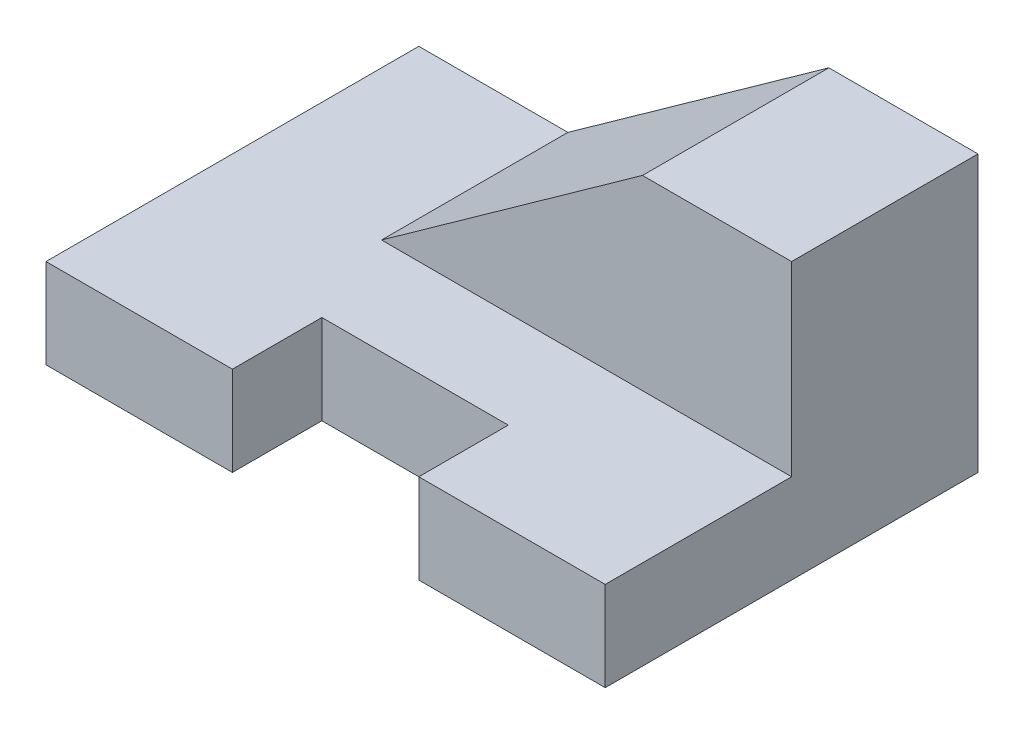
ISO-10303-21;
HEADER;
FILE_DESCRIPTION(('STEP AP214'),'2;1');
FILE_NAME('part.step','',(''),(''),'','','');
FILE_SCHEMA(('AUTOMOTIVE_DESIGN { 1 0 10303 214 1 1 1 1 }'));
ENDSEC;
DATA;
#1=APPLICATION_CONTEXT('core data for automotive mechanical design processes');
#2=APPLICATION_PROTOCOL_DEFINITION('international standard','automotive_design',2000,#1);
#3=PRODUCT_CONTEXT('',#1,'mechanical');
#4=PRODUCT('Part','Part','',(#3));
#5=PRODUCT_RELATED_PRODUCT_CATEGORY('part','',(#4));
#6=PRODUCT_DEFINITION_FORMATION('','',#4);
#7=PRODUCT_DEFINITION_CONTEXT('part definition',#1,'design');
#8=PRODUCT_DEFINITION('design','',#6,#7);
#9=PRODUCT_DEFINITION_SHAPE('','',#8);
#10=(LENGTH_UNIT() NAMED_UNIT(*) SI_UNIT(.MILLI.,.METRE.));
#11=(NAMED_UNIT(*) PLANE_ANGLE_UNIT() SI_UNIT($,.RADIAN.));
#12=(NAMED_UNIT(*) SI_UNIT($,.STERADIAN.) SOLID_ANGLE_UNIT());
#13=UNCERTAINTY_MEASURE_WITH_UNIT(LENGTH_MEASURE(1.E-05),#10,'distance_accuracy_value','');
#14=(GEOMETRIC_REPRESENTATION_CONTEXT(3) GLOBAL_UNCERTAINTY_ASSIGNED_CONTEXT((#13)) GLOBAL_UNIT_ASSIGNED_CONTEXT((#10,
#11,#12)) REPRESENTATION_CONTEXT('',''));
#15=CARTESIAN_POINT('',(0.,0.,0.));
#16=DIRECTION('',(0.,0.,1.));
#17=DIRECTION('',(1.,0.,0.));
#18=AXIS2_PLACEMENT_3D('',#15,#16,#17);
#19=CARTESIAN_POINT('',(0.,0.,50.));
#20=DIRECTION('',(1.,0.,0.));
#21=DIRECTION('',(0.,0.,-1.));
#22=AXIS2_PLACEMENT_3D('',#19,#20,#21);
#23=PLANE('',#22);
#24=DIRECTION('',(0.,-1.,0.));
#25=VECTOR('',#24,1.);
#26=CARTESIAN_POINT('',(0.,0.,0.));
#27=LINE('',#26,#25);
#28=CARTESIAN_POINT('',(0.,37.,0.));
#29=VERTEX_POINT('',#28);
#30=CARTESIAN_POINT('',(0.,0.,0.));
#31=VERTEX_POINT('',#30);
#32=EDGE_CURVE('E206',#29,#31,#27,.T.);
#33=ORIENTED_EDGE('',*,*,#32,.F.);
#34=DIRECTION('',(0.,0.,-1.));
#35=VECTOR('',#34,1.);
#36=CARTESIAN_POINT('',(0.,37.,25.));
#37=LINE('',#36,#35);
#38=CARTESIAN_POINT('',(0.,37.,25.));
#39=VERTEX_POINT('',#38);
#40=EDGE_CURVE('E163',#39,#29,#37,.T.);
#41=ORIENTED_EDGE('',*,*,#40,.F.);
#42=DIRECTION('',(0.,1.,0.));
#43=VECTOR('',#42,1.);
#44=CARTESIAN_POINT('',(0.,0.,25.));
#45=LINE('',#44,#43);
#46=CARTESIAN_POINT('',(0.,12.,25.));
#47=VERTEX_POINT('',#46);
#48=EDGE_CURVE('E146',#47,#39,#45,.T.);
#49=ORIENTED_EDGE('',*,*,#48,.F.);
#50=DIRECTION('',(0.,0.,-1.));
#51=VECTOR('',#50,1.);
#52=CARTESIAN_POINT('',(0.,12.,50.));
#53=LINE('',#52,#51);
#54=CARTESIAN_POINT('',(0.,12.,50.));
#55=VERTEX_POINT('',#54);
#56=EDGE_CURVE('E11',#55,#47,#53,.T.);
#57=ORIENTED_EDGE('',*,*,#56,.F.);
#58=DIRECTION('',(0.,-1.,0.));
#59=VECTOR('',#58,1.);
#60=CARTESIAN_POINT('',(0.,0.,50.));
#61=LINE('',#60,#59);
#62=CARTESIAN_POINT('',(0.,0.,50.));
#63=VERTEX_POINT('',#62);
#64=EDGE_CURVE('E207',#55,#63,#61,.T.);
#65=ORIENTED_EDGE('',*,*,#64,.T.);
#66=DIRECTION('',(0.,0.,-1.));
#67=VECTOR('',#66,1.);
#68=CARTESIAN_POINT('',(0.,0.,50.));
#69=LINE('',#68,#67);
#70=EDGE_CURVE('E222',#63,#31,#69,.T.);
#71=ORIENTED_EDGE('',*,*,#70,.T.);
#72=EDGE_LOOP('',(#33,#41,#49,#57,#65,#71));
#73=FACE_BOUND('',#72,.T.);
#74=ADVANCED_FACE('F47',(#73),#23,.T.);
#75=CARTESIAN_POINT('',(0.,12.,50.));
#76=DIRECTION('',(0.,1.,0.));
#77=DIRECTION('',(0.,0.,1.));
#78=AXIS2_PLACEMENT_3D('',#75,#76,#77);
#79=PLANE('',#78);
#80=DIRECTION('',(1.,0.,0.));
#81=VECTOR('',#80,1.);
#82=CARTESIAN_POINT('',(0.,12.,25.));
#83=LINE('',#82,#81);
#84=CARTESIAN_POINT('',(-55.,12.,25.));
#85=VERTEX_POINT('',#84);
#86=EDGE_CURVE('E140',#85,#47,#83,.T.);
#87=ORIENTED_EDGE('',*,*,#86,.F.);
#88=DIRECTION('',(0.,0.,-1.));
#89=VECTOR('',#88,1.);
#90=CARTESIAN_POINT('',(-55.,12.,25.));
#91=LINE('',#90,#89);
#92=CARTESIAN_POINT('',(-55.,12.,0.));
#93=VERTEX_POINT('',#92);
#94=EDGE_CURVE('E136',#85,#93,#91,.T.);
#95=ORIENTED_EDGE('',*,*,#94,.T.);
#96=DIRECTION('',(1.,0.,0.));
#97=VECTOR('',#96,1.);
#98=CARTESIAN_POINT('',(0.,12.,0.));
#99=LINE('',#98,#97);
#100=CARTESIAN_POINT('',(-75.,12.,0.));
#101=VERTEX_POINT('',#100);
#102=EDGE_CURVE('E226',#101,#93,#99,.T.);
#103=ORIENTED_EDGE('',*,*,#102,.F.);
#104=DIRECTION('',(0.,0.,-1.));
#105=VECTOR('',#104,1.);
#106=CARTESIAN_POINT('',(-75.,12.,50.));
#107=LINE('',#106,#105);
#108=CARTESIAN_POINT('',(-75.,12.,50.));
#109=VERTEX_POINT('',#108);
#110=EDGE_CURVE('E187',#109,#101,#107,.T.);
#111=ORIENTED_EDGE('',*,*,#110,.F.);
#112=DIRECTION('',(1.,0.,0.));
#113=VECTOR('',#112,1.);
#114=CARTESIAN_POINT('',(0.,12.,50.));
#115=LINE('',#114,#113);
#116=CARTESIAN_POINT('',(-50.,12.,50.));
#117=VERTEX_POINT('',#116);
#118=EDGE_CURVE('E170',#109,#117,#115,.T.);
#119=ORIENTED_EDGE('',*,*,#118,.T.);
#120=DIRECTION('',(0.,0.,-1.));
#121=VECTOR('',#120,1.);
#122=CARTESIAN_POINT('',(-50.,12.,50.));
#123=LINE('',#122,#121);
#124=CARTESIAN_POINT('',(-50.,12.,38.));
#125=VERTEX_POINT('',#124);
#126=EDGE_CURVE('E191',#117,#125,#123,.T.);
#127=ORIENTED_EDGE('',*,*,#126,.T.);
#128=DIRECTION('',(1.,0.,0.));
#129=VECTOR('',#128,1.);
#130=CARTESIAN_POINT('',(0.,12.,38.));
#131=LINE('',#130,#129);
#132=CARTESIAN_POINT('',(-25.,12.,38.));
#133=VERTEX_POINT('',#132);
#134=EDGE_CURVE('E195',#125,#133,#131,.T.);
#135=ORIENTED_EDGE('',*,*,#134,.T.);
#136=DIRECTION('',(0.,0.,-1.));
#137=VECTOR('',#136,1.);
#138=CARTESIAN_POINT('',(-25.,12.,50.));
#139=LINE('',#138,#137);
#140=CARTESIAN_POINT('',(-25.,12.,50.));
#141=VERTEX_POINT('',#140);
#142=EDGE_CURVE('E55',#141,#133,#139,.T.);
#143=ORIENTED_EDGE('',*,*,#142,.F.);
#144=DIRECTION('',(1.,0.,0.));
#145=VECTOR('',#144,1.);
#146=CARTESIAN_POINT('',(0.,12.,50.));
#147=LINE('',#146,#145);
#148=EDGE_CURVE('E211',#141,#55,#147,.T.);
#149=ORIENTED_EDGE('',*,*,#148,.T.);
#150=ORIENTED_EDGE('',*,*,#56,.T.);
#151=EDGE_LOOP('',(#87,#95,#103,#111,#119,#127,#135,#143,#149,#150));
#152=FACE_BOUND('',#151,.T.);
#153=ADVANCED_FACE('F246',(#152),#79,.T.);
#154=CARTESIAN_POINT('',(-25.,0.,50.));
#155=DIRECTION('',(1.,0.,0.));
#156=DIRECTION('',(0.,0.,-1.));
#157=AXIS2_PLACEMENT_3D('',#154,#155,#156);
#158=PLANE('',#157);
#159=ORIENTED_EDGE('',*,*,#142,.T.);
#160=DIRECTION('',(0.,-1.,0.));
#161=VECTOR('',#160,1.);
#162=CARTESIAN_POINT('',(-25.,0.,38.));
#163=LINE('',#162,#161);
#164=CARTESIAN_POINT('',(-25.,0.,38.));
#165=VERTEX_POINT('',#164);
#166=EDGE_CURVE('E203',#133,#165,#163,.T.);
#167=ORIENTED_EDGE('',*,*,#166,.T.);
#168=DIRECTION('',(0.,0.,-1.));
#169=VECTOR('',#168,1.);
#170=CARTESIAN_POINT('',(-25.,0.,50.));
#171=LINE('',#170,#169);
#172=CARTESIAN_POINT('',(-25.,0.,50.));
#173=VERTEX_POINT('',#172);
#174=EDGE_CURVE('E235',#173,#165,#171,.T.);
#175=ORIENTED_EDGE('',*,*,#174,.F.);
#176=DIRECTION('',(0.,-1.,0.));
#177=VECTOR('',#176,1.);
#178=CARTESIAN_POINT('',(-25.,0.,50.));
#179=LINE('',#178,#177);
#180=EDGE_CURVE('E216',#141,#173,#179,.T.);
#181=ORIENTED_EDGE('',*,*,#180,.F.);
#182=EDGE_LOOP('',(#159,#167,#175,#181));
#183=FACE_BOUND('',#182,.T.);
#184=ADVANCED_FACE('F242',(#183),#158,.F.);
#185=CARTESIAN_POINT('',(0.,0.,50.));
#186=DIRECTION('',(0.,1.,0.));
#187=DIRECTION('',(0.,0.,1.));
#188=AXIS2_PLACEMENT_3D('',#185,#186,#187);
#189=PLANE('',#188);
#190=DIRECTION('',(1.,0.,0.));
#191=VECTOR('',#190,1.);
#192=CARTESIAN_POINT('',(0.,0.,0.));
#193=LINE('',#192,#191);
#194=CARTESIAN_POINT('',(-75.,0.,0.));
#195=VERTEX_POINT('',#194);
#196=EDGE_CURVE('E212',#195,#31,#193,.T.);
#197=ORIENTED_EDGE('',*,*,#196,.T.);
#198=ORIENTED_EDGE('',*,*,#70,.F.);
#199=DIRECTION('',(1.,0.,0.));
#200=VECTOR('',#199,1.);
#201=CARTESIAN_POINT('',(0.,0.,50.));
#202=LINE('',#201,#200);
#203=EDGE_CURVE('E219',#173,#63,#202,.T.);
#204=ORIENTED_EDGE('',*,*,#203,.F.);
#205=ORIENTED_EDGE('',*,*,#174,.T.);
#206=DIRECTION('',(1.,0.,0.));
#207=VECTOR('',#206,1.);
#208=CARTESIAN_POINT('',(0.,0.,38.));
#209=LINE('',#208,#207);
#210=CARTESIAN_POINT('',(-50.,0.,38.));
#211=VERTEX_POINT('',#210);
#212=EDGE_CURVE('E70',#211,#165,#209,.T.);
#213=ORIENTED_EDGE('',*,*,#212,.F.);
#214=DIRECTION('',(0.,0.,-1.));
#215=VECTOR('',#214,1.);
#216=CARTESIAN_POINT('',(-50.,0.,50.));
#217=LINE('',#216,#215);
#218=CARTESIAN_POINT('',(-50.,0.,50.));
#219=VERTEX_POINT('',#218);
#220=EDGE_CURVE('E179',#219,#211,#217,.T.);
#221=ORIENTED_EDGE('',*,*,#220,.F.);
#222=DIRECTION('',(1.,0.,0.));
#223=VECTOR('',#222,1.);
#224=CARTESIAN_POINT('',(0.,0.,50.));
#225=LINE('',#224,#223);
#226=CARTESIAN_POINT('',(-75.,0.,50.));
#227=VERTEX_POINT('',#226);
#228=EDGE_CURVE('E177',#227,#219,#225,.T.);
#229=ORIENTED_EDGE('',*,*,#228,.F.);
#230=DIRECTION('',(0.,0.,-1.));
#231=VECTOR('',#230,1.);
#232=CARTESIAN_POINT('',(-75.,0.,50.));
#233=LINE('',#232,#231);
#234=EDGE_CURVE('E183',#227,#195,#233,.T.);
#235=ORIENTED_EDGE('',*,*,#234,.T.);
#236=EDGE_LOOP('',(#197,#198,#204,#205,#213,#221,#229,#235));
#237=FACE_BOUND('',#236,.T.);
#238=ADVANCED_FACE('F285',(#237),#189,.F.);
#239=CARTESIAN_POINT('',(0.,0.,50.));
#240=DIRECTION('',(0.,0.,1.));
#241=DIRECTION('',(1.,0.,0.));
#242=AXIS2_PLACEMENT_3D('',#239,#240,#241);
#243=PLANE('',#242);
#244=ORIENTED_EDGE('',*,*,#64,.F.);
#245=ORIENTED_EDGE('',*,*,#148,.F.);
#246=ORIENTED_EDGE('',*,*,#180,.T.);
#247=ORIENTED_EDGE('',*,*,#203,.T.);
#248=EDGE_LOOP('',(#244,#245,#246,#247));
#249=FACE_BOUND('',#248,.T.);
#250=ADVANCED_FACE('F261',(#249),#243,.T.);
#251=CARTESIAN_POINT('',(0.,0.,0.));
#252=DIRECTION('',(0.,0.,1.));
#253=DIRECTION('',(1.,0.,0.));
#254=AXIS2_PLACEMENT_3D('',#251,#252,#253);
#255=PLANE('',#254);
#256=ORIENTED_EDGE('',*,*,#32,.T.);
#257=ORIENTED_EDGE('',*,*,#196,.F.);
#258=DIRECTION('',(0.,-1.,0.));
#259=VECTOR('',#258,1.);
#260=CARTESIAN_POINT('',(-75.,0.,0.));
#261=LINE('',#260,#259);
#262=EDGE_CURVE('E156',#101,#195,#261,.T.);
#263=ORIENTED_EDGE('',*,*,#262,.F.);
#264=ORIENTED_EDGE('',*,*,#102,.T.);
#265=DIRECTION('',(-0.813733471206735,-0.581238193719097,0.));
#266=VECTOR('',#265,1.);
#267=CARTESIAN_POINT('',(-24.2567567567568,33.9594594594595,0.));
#268=LINE('',#267,#266);
#269=CARTESIAN_POINT('',(-20.,37.,0.));
#270=VERTEX_POINT('',#269);
#271=EDGE_CURVE('E62',#270,#93,#268,.T.);
#272=ORIENTED_EDGE('',*,*,#271,.F.);
#273=DIRECTION('',(-1.,0.,0.));
#274=VECTOR('',#273,1.);
#275=CARTESIAN_POINT('',(0.,37.,0.));
#276=LINE('',#275,#274);
#277=EDGE_CURVE('E154',#29,#270,#276,.T.);
#278=ORIENTED_EDGE('',*,*,#277,.F.);
#279=EDGE_LOOP('',(#256,#257,#263,#264,#272,#278));
#280=FACE_BOUND('',#279,.T.);
#281=ADVANCED_FACE('F251',(#280),#255,.F.);
#282=CARTESIAN_POINT('',(0.,0.,38.));
#283=DIRECTION('',(0.,0.,1.));
#284=DIRECTION('',(1.,0.,0.));
#285=AXIS2_PLACEMENT_3D('',#282,#283,#284);
#286=PLANE('',#285);
#287=ORIENTED_EDGE('',*,*,#134,.F.);
#288=DIRECTION('',(0.,-1.,0.));
#289=VECTOR('',#288,1.);
#290=CARTESIAN_POINT('',(-50.,0.,38.));
#291=LINE('',#290,#289);
#292=EDGE_CURVE('E198',#125,#211,#291,.T.);
#293=ORIENTED_EDGE('',*,*,#292,.T.);
#294=ORIENTED_EDGE('',*,*,#212,.T.);
#295=ORIENTED_EDGE('',*,*,#166,.F.);
#296=EDGE_LOOP('',(#287,#293,#294,#295));
#297=FACE_BOUND('',#296,.T.);
#298=ADVANCED_FACE('F248',(#297),#286,.T.);
#299=CARTESIAN_POINT('',(-50.,0.,50.));
#300=DIRECTION('',(1.,0.,0.));
#301=DIRECTION('',(0.,1.,0.));
#302=AXIS2_PLACEMENT_3D('',#299,#300,#301);
#303=PLANE('',#302);
#304=ORIENTED_EDGE('',*,*,#292,.F.);
#305=ORIENTED_EDGE('',*,*,#126,.F.);
#306=DIRECTION('',(0.,-1.,0.));
#307=VECTOR('',#306,1.);
#308=CARTESIAN_POINT('',(-50.,0.,50.));
#309=LINE('',#308,#307);
#310=EDGE_CURVE('E161',#117,#219,#309,.T.);
#311=ORIENTED_EDGE('',*,*,#310,.T.);
#312=ORIENTED_EDGE('',*,*,#220,.T.);
#313=EDGE_LOOP('',(#304,#305,#311,#312));
#314=FACE_BOUND('',#313,.T.);
#315=ADVANCED_FACE('F250',(#314),#303,.T.);
#316=CARTESIAN_POINT('',(-75.,0.,50.));
#317=DIRECTION('',(1.,0.,0.));
#318=DIRECTION('',(0.,0.,-1.));
#319=AXIS2_PLACEMENT_3D('',#316,#317,#318);
#320=PLANE('',#319);
#321=ORIENTED_EDGE('',*,*,#262,.T.);
#322=ORIENTED_EDGE('',*,*,#234,.F.);
#323=DIRECTION('',(0.,-1.,0.));
#324=VECTOR('',#323,1.);
#325=CARTESIAN_POINT('',(-75.,0.,50.));
#326=LINE('',#325,#324);
#327=EDGE_CURVE('E174',#109,#227,#326,.T.);
#328=ORIENTED_EDGE('',*,*,#327,.F.);
#329=ORIENTED_EDGE('',*,*,#110,.T.);
#330=EDGE_LOOP('',(#321,#322,#328,#329));
#331=FACE_BOUND('',#330,.T.);
#332=ADVANCED_FACE('F257',(#331),#320,.F.);
#333=CARTESIAN_POINT('',(0.,0.,50.));
#334=DIRECTION('',(0.,0.,1.));
#335=DIRECTION('',(1.,0.,0.));
#336=AXIS2_PLACEMENT_3D('',#333,#334,#335);
#337=PLANE('',#336);
#338=ORIENTED_EDGE('',*,*,#310,.F.);
#339=ORIENTED_EDGE('',*,*,#118,.F.);
#340=ORIENTED_EDGE('',*,*,#327,.T.);
#341=ORIENTED_EDGE('',*,*,#228,.T.);
#342=EDGE_LOOP('',(#338,#339,#340,#341));
#343=FACE_BOUND('',#342,.T.);
#344=ADVANCED_FACE('F294',(#343),#337,.T.);
#345=CARTESIAN_POINT('',(0.,37.,25.));
#346=DIRECTION('',(0.,-1.,0.));
#347=DIRECTION('',(0.,0.,-1.));
#348=AXIS2_PLACEMENT_3D('',#345,#346,#347);
#349=PLANE('',#348);
#350=ORIENTED_EDGE('',*,*,#277,.T.);
#351=DIRECTION('',(0.,0.,-1.));
#352=VECTOR('',#351,1.);
#353=CARTESIAN_POINT('',(-20.,37.,25.));
#354=LINE('',#353,#352);
#355=CARTESIAN_POINT('',(-20.,37.,25.));
#356=VERTEX_POINT('',#355);
#357=EDGE_CURVE('E134',#356,#270,#354,.T.);
#358=ORIENTED_EDGE('',*,*,#357,.F.);
#359=DIRECTION('',(-1.,0.,0.));
#360=VECTOR('',#359,1.);
#361=CARTESIAN_POINT('',(0.,37.,25.));
#362=LINE('',#361,#360);
#363=EDGE_CURVE('E141',#39,#356,#362,.T.);
#364=ORIENTED_EDGE('',*,*,#363,.F.);
#365=ORIENTED_EDGE('',*,*,#40,.T.);
#366=EDGE_LOOP('',(#350,#358,#364,#365));
#367=FACE_BOUND('',#366,.T.);
#368=ADVANCED_FACE('F152',(#367),#349,.F.);
#369=CARTESIAN_POINT('',(-24.2567567567568,33.9594594594595,25.));
#370=DIRECTION('',(0.581238193719097,-0.813733471206735,0.));
#371=DIRECTION('',(0.813733471206735,0.581238193719097,0.));
#372=AXIS2_PLACEMENT_3D('',#369,#370,#371);
#373=PLANE('',#372);
#374=ORIENTED_EDGE('',*,*,#271,.T.);
#375=ORIENTED_EDGE('',*,*,#94,.F.);
#376=DIRECTION('',(-0.813733471206735,-0.581238193719097,0.));
#377=VECTOR('',#376,1.);
#378=CARTESIAN_POINT('',(-24.2567567567568,33.9594594594595,25.));
#379=LINE('',#378,#377);
#380=EDGE_CURVE('E130',#356,#85,#379,.T.);
#381=ORIENTED_EDGE('',*,*,#380,.F.);
#382=ORIENTED_EDGE('',*,*,#357,.T.);
#383=EDGE_LOOP('',(#374,#375,#381,#382));
#384=FACE_BOUND('',#383,.T.);
#385=ADVANCED_FACE('F132',(#384),#373,.F.);
#386=CARTESIAN_POINT('',(0.,0.,25.));
#387=DIRECTION('',(0.,0.,1.));
#388=DIRECTION('',(1.,0.,0.));
#389=AXIS2_PLACEMENT_3D('',#386,#387,#388);
#390=PLANE('',#389);
#391=ORIENTED_EDGE('',*,*,#363,.T.);
#392=ORIENTED_EDGE('',*,*,#380,.T.);
#393=ORIENTED_EDGE('',*,*,#86,.T.);
#394=ORIENTED_EDGE('',*,*,#48,.T.);
#395=EDGE_LOOP('',(#391,#392,#393,#394));
#396=FACE_BOUND('',#395,.T.);
#397=ADVANCED_FACE('F144',(#396),#390,.T.);
#398=CLOSED_SHELL('',(#74,#153,#184,#238,#250,#281,#298,#315,#332,#344,#368,#385,#397));
#399=MANIFOLD_SOLID_BREP('B2',#398);
#400=ADVANCED_BREP_SHAPE_REPRESENTATION('',(#18,#399),#14);
#401=SHAPE_DEFINITION_REPRESENTATION(#9,#400);
ENDSEC;
END-ISO-10303-21;
